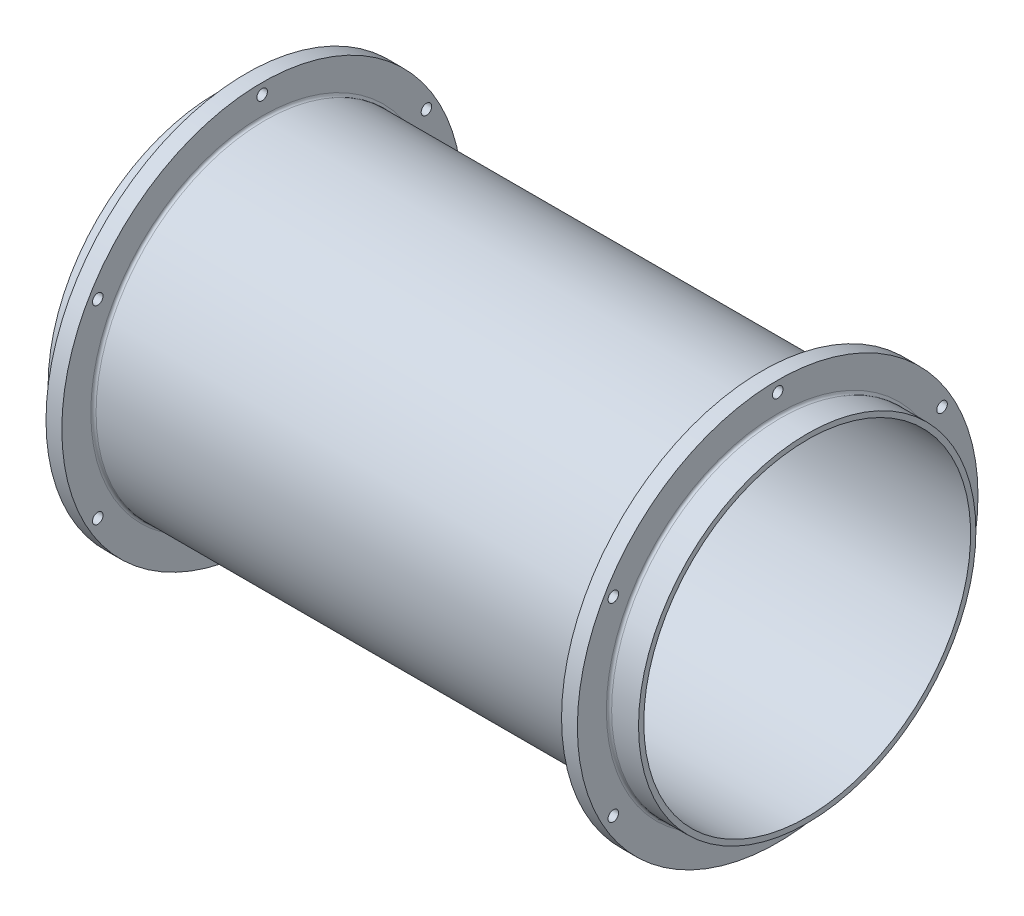
ISO-10303-21;
HEADER;
FILE_DESCRIPTION(('STEP AP214'),'2;1');
FILE_NAME('part.step','',(''),(''),'','','');
FILE_SCHEMA(('AUTOMOTIVE_DESIGN { 1 0 10303 214 1 1 1 1 }'));
ENDSEC;
DATA;
#1=APPLICATION_CONTEXT('core data for automotive mechanical design processes');
#2=APPLICATION_PROTOCOL_DEFINITION('international standard','automotive_design',2000,#1);
#3=PRODUCT_CONTEXT('',#1,'mechanical');
#4=PRODUCT('Part','Part','',(#3));
#5=PRODUCT_RELATED_PRODUCT_CATEGORY('part','',(#4));
#6=PRODUCT_DEFINITION_FORMATION('','',#4);
#7=PRODUCT_DEFINITION_CONTEXT('part definition',#1,'design');
#8=PRODUCT_DEFINITION('design','',#6,#7);
#9=PRODUCT_DEFINITION_SHAPE('','',#8);
#10=(LENGTH_UNIT() NAMED_UNIT(*) SI_UNIT(.MILLI.,.METRE.));
#11=(NAMED_UNIT(*) PLANE_ANGLE_UNIT() SI_UNIT($,.RADIAN.));
#12=(NAMED_UNIT(*) SI_UNIT($,.STERADIAN.) SOLID_ANGLE_UNIT());
#13=UNCERTAINTY_MEASURE_WITH_UNIT(LENGTH_MEASURE(1.E-05),#10,'distance_accuracy_value','');
#14=(GEOMETRIC_REPRESENTATION_CONTEXT(3) GLOBAL_UNCERTAINTY_ASSIGNED_CONTEXT((#13)) GLOBAL_UNIT_ASSIGNED_CONTEXT((#10,
#11,#12)) REPRESENTATION_CONTEXT('',''));
#15=CARTESIAN_POINT('',(0.,0.,0.));
#16=DIRECTION('',(0.,0.,1.));
#17=DIRECTION('',(1.,0.,0.));
#18=AXIS2_PLACEMENT_3D('',#15,#16,#17);
#19=CARTESIAN_POINT('',(0.,0.,0.));
#20=DIRECTION('',(-1.,0.,0.));
#21=DIRECTION('',(0.,0.,1.));
#22=AXIS2_PLACEMENT_3D('',#19,#20,#21);
#23=CYLINDRICAL_SURFACE('',#22,98.425);
#24=CARTESIAN_POINT('',(-177.8,0.,0.));
#25=DIRECTION('',(-1.,0.,0.));
#26=DIRECTION('',(0.,0.,1.));
#27=AXIS2_PLACEMENT_3D('',#24,#25,#26);
#28=CIRCLE('',#27,98.425);
#29=CARTESIAN_POINT('',(-177.8,0.,98.425));
#30=VERTEX_POINT('',#29);
#31=EDGE_CURVE('E120',#30,#30,#28,.T.);
#32=ORIENTED_EDGE('',*,*,#31,.T.);
#33=EDGE_LOOP('',(#32));
#34=FACE_BOUND('',#33,.T.);
#35=CARTESIAN_POINT('',(177.8,0.,0.));
#36=DIRECTION('',(-1.,0.,0.));
#37=DIRECTION('',(0.,0.,1.));
#38=AXIS2_PLACEMENT_3D('',#35,#36,#37);
#39=CIRCLE('',#38,98.425);
#40=CARTESIAN_POINT('',(177.8,0.,98.425));
#41=VERTEX_POINT('',#40);
#42=EDGE_CURVE('E69',#41,#41,#39,.T.);
#43=ORIENTED_EDGE('',*,*,#42,.F.);
#44=EDGE_LOOP('',(#43));
#45=FACE_BOUND('',#44,.T.);
#46=ADVANCED_FACE('F37',(#34,#45),#23,.F.);
#47=CARTESIAN_POINT('',(177.8,0.,0.));
#48=DIRECTION('',(-1.,0.,0.));
#49=DIRECTION('',(0.,0.,1.));
#50=AXIS2_PLACEMENT_3D('',#47,#48,#49);
#51=PLANE('',#50);
#52=CARTESIAN_POINT('',(177.8,0.,0.));
#53=DIRECTION('',(-1.,0.,0.));
#54=DIRECTION('',(0.,0.,1.));
#55=AXIS2_PLACEMENT_3D('',#52,#53,#54);
#56=CIRCLE('',#55,101.6);
#57=CARTESIAN_POINT('',(177.8,0.,101.6));
#58=VERTEX_POINT('',#57);
#59=EDGE_CURVE('E102',#58,#58,#56,.T.);
#60=ORIENTED_EDGE('',*,*,#59,.F.);
#61=EDGE_LOOP('',(#60));
#62=FACE_BOUND('',#61,.T.);
#63=ORIENTED_EDGE('',*,*,#42,.T.);
#64=EDGE_LOOP('',(#63));
#65=FACE_BOUND('',#64,.T.);
#66=ADVANCED_FACE('F205',(#62,#65),#51,.F.);
#67=CARTESIAN_POINT('',(0.,0.,0.));
#68=DIRECTION('',(-1.,0.,0.));
#69=DIRECTION('',(0.,0.,1.));
#70=AXIS2_PLACEMENT_3D('',#67,#68,#69);
#71=CYLINDRICAL_SURFACE('',#70,101.6);
#72=CARTESIAN_POINT('',(161.6075,0.,0.));
#73=DIRECTION('',(-1.,0.,0.));
#74=DIRECTION('',(0.,0.,1.));
#75=AXIS2_PLACEMENT_3D('',#72,#73,#74);
#76=CIRCLE('',#75,101.6);
#77=CARTESIAN_POINT('',(161.6075,0.,101.6));
#78=VERTEX_POINT('',#77);
#79=EDGE_CURVE('E63',#78,#78,#76,.F.);
#80=ORIENTED_EDGE('',*,*,#79,.T.);
#81=EDGE_LOOP('',(#80));
#82=FACE_BOUND('',#81,.T.);
#83=ORIENTED_EDGE('',*,*,#59,.T.);
#84=EDGE_LOOP('',(#83));
#85=FACE_BOUND('',#84,.T.);
#86=ADVANCED_FACE('F172',(#82,#85),#71,.T.);
#87=CARTESIAN_POINT('',(160.02,0.,0.));
#88=DIRECTION('',(-1.,0.,0.));
#89=DIRECTION('',(0.,0.,1.));
#90=AXIS2_PLACEMENT_3D('',#87,#88,#89);
#91=PLANE('',#90);
#92=CARTESIAN_POINT('',(160.02,0.,0.));
#93=DIRECTION('',(-1.,0.,0.));
#94=DIRECTION('',(0.,0.,1.));
#95=AXIS2_PLACEMENT_3D('',#92,#93,#94);
#96=CIRCLE('',#95,103.1875);
#97=CARTESIAN_POINT('',(160.02,0.,103.1875));
#98=VERTEX_POINT('',#97);
#99=EDGE_CURVE('E66',#98,#98,#96,.T.);
#100=ORIENTED_EDGE('',*,*,#99,.T.);
#101=EDGE_LOOP('',(#100));
#102=FACE_BOUND('',#101,.T.);
#103=CARTESIAN_POINT('',(160.02,114.3,0.));
#104=DIRECTION('',(1.,0.,0.));
#105=DIRECTION('',(0.,0.,-1.));
#106=AXIS2_PLACEMENT_3D('',#103,#104,#105);
#107=CIRCLE('',#106,3.17499999999998);
#108=CARTESIAN_POINT('',(160.02,114.3,-3.17499999999998));
#109=VERTEX_POINT('',#108);
#110=EDGE_CURVE('E99',#109,#109,#107,.T.);
#111=ORIENTED_EDGE('',*,*,#110,.F.);
#112=EDGE_LOOP('',(#111));
#113=FACE_BOUND('',#112,.T.);
#114=CARTESIAN_POINT('',(160.02,57.1499999999943,98.9867036525581));
#115=DIRECTION('',(1.,0.,0.));
#116=DIRECTION('',(0.,0.,-1.));
#117=AXIS2_PLACEMENT_3D('',#114,#115,#116);
#118=CIRCLE('',#117,3.17500000000607);
#119=CARTESIAN_POINT('',(160.02,57.1499999999943,95.8117036525521));
#120=VERTEX_POINT('',#119);
#121=EDGE_CURVE('E152',#120,#120,#118,.T.);
#122=ORIENTED_EDGE('',*,*,#121,.F.);
#123=EDGE_LOOP('',(#122));
#124=FACE_BOUND('',#123,.T.);
#125=CARTESIAN_POINT('',(160.02,-57.1500000000056,98.9867036525516));
#126=DIRECTION('',(1.,0.,0.));
#127=DIRECTION('',(0.,0.,-1.));
#128=AXIS2_PLACEMENT_3D('',#125,#126,#127);
#129=CIRCLE('',#128,3.17500000001196);
#130=CARTESIAN_POINT('',(160.02,-57.1500000000056,95.8117036525397));
#131=VERTEX_POINT('',#130);
#132=EDGE_CURVE('E148',#131,#131,#129,.T.);
#133=ORIENTED_EDGE('',*,*,#132,.F.);
#134=EDGE_LOOP('',(#133));
#135=FACE_BOUND('',#134,.T.);
#136=CARTESIAN_POINT('',(160.02,-114.3,-1.29524124128379E-11));
#137=DIRECTION('',(1.,0.,0.));
#138=DIRECTION('',(0.,0.,-1.));
#139=AXIS2_PLACEMENT_3D('',#136,#137,#138);
#140=CIRCLE('',#139,3.17500000001313);
#141=CARTESIAN_POINT('',(160.02,-114.3,-3.17500000002608));
#142=VERTEX_POINT('',#141);
#143=EDGE_CURVE('E151',#142,#142,#140,.T.);
#144=ORIENTED_EDGE('',*,*,#143,.F.);
#145=EDGE_LOOP('',(#144));
#146=FACE_BOUND('',#145,.T.);
#147=CARTESIAN_POINT('',(160.02,-57.1499999999944,-98.9867036525711));
#148=DIRECTION('',(1.,0.,0.));
#149=DIRECTION('',(0.,0.,-1.));
#150=AXIS2_PLACEMENT_3D('',#147,#148,#149);
#151=CIRCLE('',#150,3.17500000000817);
#152=CARTESIAN_POINT('',(160.02,-57.1499999999944,-102.161703652579));
#153=VERTEX_POINT('',#152);
#154=EDGE_CURVE('E155',#153,#153,#151,.T.);
#155=ORIENTED_EDGE('',*,*,#154,.F.);
#156=EDGE_LOOP('',(#155));
#157=FACE_BOUND('',#156,.T.);
#158=CARTESIAN_POINT('',(160.02,57.1500000000056,-98.9867036525646));
#159=DIRECTION('',(1.,0.,0.));
#160=DIRECTION('',(0.,0.,-1.));
#161=AXIS2_PLACEMENT_3D('',#158,#159,#160);
#162=CIRCLE('',#161,3.17500000000172);
#163=CARTESIAN_POINT('',(160.02,57.1500000000056,-102.161703652566));
#164=VERTEX_POINT('',#163);
#165=EDGE_CURVE('E158',#164,#164,#162,.T.);
#166=ORIENTED_EDGE('',*,*,#165,.F.);
#167=EDGE_LOOP('',(#166));
#168=FACE_BOUND('',#167,.T.);
#169=CARTESIAN_POINT('',(160.02,0.,0.));
#170=DIRECTION('',(-1.,0.,0.));
#171=DIRECTION('',(0.,0.,1.));
#172=AXIS2_PLACEMENT_3D('',#169,#170,#171);
#173=CIRCLE('',#172,120.65);
#174=CARTESIAN_POINT('',(160.02,0.,120.65));
#175=VERTEX_POINT('',#174);
#176=EDGE_CURVE('E105',#175,#175,#173,.T.);
#177=ORIENTED_EDGE('',*,*,#176,.F.);
#178=EDGE_LOOP('',(#177));
#179=FACE_BOUND('',#178,.T.);
#180=ADVANCED_FACE('F168',(#102,#113,#124,#135,#146,#157,#168,#179),#91,.F.);
#181=CARTESIAN_POINT('',(0.,0.,0.));
#182=DIRECTION('',(-1.,0.,0.));
#183=DIRECTION('',(0.,0.,1.));
#184=AXIS2_PLACEMENT_3D('',#181,#182,#183);
#185=CYLINDRICAL_SURFACE('',#184,120.65);
#186=ORIENTED_EDGE('',*,*,#176,.T.);
#187=EDGE_LOOP('',(#186));
#188=FACE_BOUND('',#187,.T.);
#189=CARTESIAN_POINT('',(150.495,0.,0.));
#190=DIRECTION('',(-1.,0.,0.));
#191=DIRECTION('',(0.,0.,1.));
#192=AXIS2_PLACEMENT_3D('',#189,#190,#191);
#193=CIRCLE('',#192,120.65);
#194=CARTESIAN_POINT('',(150.495,0.,120.65));
#195=VERTEX_POINT('',#194);
#196=EDGE_CURVE('E108',#195,#195,#193,.T.);
#197=ORIENTED_EDGE('',*,*,#196,.F.);
#198=EDGE_LOOP('',(#197));
#199=FACE_BOUND('',#198,.T.);
#200=ADVANCED_FACE('F171',(#188,#199),#185,.T.);
#201=CARTESIAN_POINT('',(150.495,0.,0.));
#202=DIRECTION('',(-1.,0.,0.));
#203=DIRECTION('',(0.,0.,1.));
#204=AXIS2_PLACEMENT_3D('',#201,#202,#203);
#205=PLANE('',#204);
#206=CARTESIAN_POINT('',(150.495,0.,0.));
#207=DIRECTION('',(-1.,0.,0.));
#208=DIRECTION('',(0.,0.,1.));
#209=AXIS2_PLACEMENT_3D('',#206,#207,#208);
#210=CIRCLE('',#209,103.1875);
#211=CARTESIAN_POINT('',(150.495,0.,103.1875));
#212=VERTEX_POINT('',#211);
#213=EDGE_CURVE('E52',#212,#212,#210,.F.);
#214=ORIENTED_EDGE('',*,*,#213,.T.);
#215=EDGE_LOOP('',(#214));
#216=FACE_BOUND('',#215,.T.);
#217=CARTESIAN_POINT('',(150.495,114.3,0.));
#218=DIRECTION('',(-1.,0.,0.));
#219=DIRECTION('',(0.,0.,1.));
#220=AXIS2_PLACEMENT_3D('',#217,#218,#219);
#221=CIRCLE('',#220,3.17499999999998);
#222=CARTESIAN_POINT('',(150.495,114.3,3.17499999999998));
#223=VERTEX_POINT('',#222);
#224=EDGE_CURVE('E123',#223,#223,#221,.T.);
#225=ORIENTED_EDGE('',*,*,#224,.F.);
#226=EDGE_LOOP('',(#225));
#227=FACE_BOUND('',#226,.T.);
#228=CARTESIAN_POINT('',(150.495,57.1499999999943,98.9867036525581));
#229=DIRECTION('',(-1.,0.,0.));
#230=DIRECTION('',(0.,0.,1.));
#231=AXIS2_PLACEMENT_3D('',#228,#229,#230);
#232=CIRCLE('',#231,3.17500000000607);
#233=CARTESIAN_POINT('',(150.495,57.1499999999943,102.161703652564));
#234=VERTEX_POINT('',#233);
#235=EDGE_CURVE('E74',#234,#234,#232,.T.);
#236=ORIENTED_EDGE('',*,*,#235,.F.);
#237=EDGE_LOOP('',(#236));
#238=FACE_BOUND('',#237,.T.);
#239=CARTESIAN_POINT('',(150.495,-57.1500000000056,98.9867036525516));
#240=DIRECTION('',(-1.,0.,0.));
#241=DIRECTION('',(0.,0.,1.));
#242=AXIS2_PLACEMENT_3D('',#239,#240,#241);
#243=CIRCLE('',#242,3.17500000001196);
#244=CARTESIAN_POINT('',(150.495,-57.1500000000056,102.161703652564));
#245=VERTEX_POINT('',#244);
#246=EDGE_CURVE('E79',#245,#245,#243,.T.);
#247=ORIENTED_EDGE('',*,*,#246,.F.);
#248=EDGE_LOOP('',(#247));
#249=FACE_BOUND('',#248,.T.);
#250=CARTESIAN_POINT('',(150.495,-114.3,-1.29524124128379E-11));
#251=DIRECTION('',(-1.,0.,0.));
#252=DIRECTION('',(0.,0.,1.));
#253=AXIS2_PLACEMENT_3D('',#250,#251,#252);
#254=CIRCLE('',#253,3.17500000001313);
#255=CARTESIAN_POINT('',(150.495,-114.3,3.17500000000018));
#256=VERTEX_POINT('',#255);
#257=EDGE_CURVE('E84',#256,#256,#254,.T.);
#258=ORIENTED_EDGE('',*,*,#257,.F.);
#259=EDGE_LOOP('',(#258));
#260=FACE_BOUND('',#259,.T.);
#261=CARTESIAN_POINT('',(150.495,-57.1499999999944,-98.9867036525711));
#262=DIRECTION('',(-1.,0.,0.));
#263=DIRECTION('',(0.,0.,1.));
#264=AXIS2_PLACEMENT_3D('',#261,#262,#263);
#265=CIRCLE('',#264,3.17500000000817);
#266=CARTESIAN_POINT('',(150.495,-57.1499999999944,-95.8117036525629));
#267=VERTEX_POINT('',#266);
#268=EDGE_CURVE('E89',#267,#267,#265,.T.);
#269=ORIENTED_EDGE('',*,*,#268,.F.);
#270=EDGE_LOOP('',(#269));
#271=FACE_BOUND('',#270,.T.);
#272=CARTESIAN_POINT('',(150.495,57.1500000000056,-98.9867036525646));
#273=DIRECTION('',(-1.,0.,0.));
#274=DIRECTION('',(0.,0.,1.));
#275=AXIS2_PLACEMENT_3D('',#272,#273,#274);
#276=CIRCLE('',#275,3.17500000000172);
#277=CARTESIAN_POINT('',(150.495,57.1500000000056,-95.8117036525629));
#278=VERTEX_POINT('',#277);
#279=EDGE_CURVE('E94',#278,#278,#276,.T.);
#280=ORIENTED_EDGE('',*,*,#279,.F.);
#281=EDGE_LOOP('',(#280));
#282=FACE_BOUND('',#281,.T.);
#283=ORIENTED_EDGE('',*,*,#196,.T.);
#284=EDGE_LOOP('',(#283));
#285=FACE_BOUND('',#284,.T.);
#286=ADVANCED_FACE('F189',(#216,#227,#238,#249,#260,#271,#282,#285),#205,.T.);
#287=CARTESIAN_POINT('',(0.,0.,0.));
#288=DIRECTION('',(-1.,0.,0.));
#289=DIRECTION('',(0.,0.,1.));
#290=AXIS2_PLACEMENT_3D('',#287,#288,#289);
#291=CYLINDRICAL_SURFACE('',#290,101.6);
#292=CARTESIAN_POINT('',(148.9075,0.,0.));
#293=DIRECTION('',(-1.,0.,0.));
#294=DIRECTION('',(0.,0.,1.));
#295=AXIS2_PLACEMENT_3D('',#292,#293,#294);
#296=CIRCLE('',#295,101.6);
#297=CARTESIAN_POINT('',(148.9075,0.,101.6));
#298=VERTEX_POINT('',#297);
#299=EDGE_CURVE('E57',#298,#298,#296,.T.);
#300=ORIENTED_EDGE('',*,*,#299,.T.);
#301=EDGE_LOOP('',(#300));
#302=FACE_BOUND('',#301,.T.);
#303=CARTESIAN_POINT('',(-148.9075,0.,0.));
#304=DIRECTION('',(-1.,0.,0.));
#305=DIRECTION('',(0.,0.,1.));
#306=AXIS2_PLACEMENT_3D('',#303,#304,#305);
#307=CIRCLE('',#306,101.6);
#308=CARTESIAN_POINT('',(-148.9075,0.,101.6));
#309=VERTEX_POINT('',#308);
#310=EDGE_CURVE('E60',#309,#309,#307,.F.);
#311=ORIENTED_EDGE('',*,*,#310,.T.);
#312=EDGE_LOOP('',(#311));
#313=FACE_BOUND('',#312,.T.);
#314=ADVANCED_FACE('F194',(#302,#313),#291,.T.);
#315=CARTESIAN_POINT('',(-150.495,0.,0.));
#316=DIRECTION('',(-1.,0.,0.));
#317=DIRECTION('',(0.,0.,1.));
#318=AXIS2_PLACEMENT_3D('',#315,#316,#317);
#319=PLANE('',#318);
#320=CARTESIAN_POINT('',(-150.495,0.,0.));
#321=DIRECTION('',(-1.,0.,0.));
#322=DIRECTION('',(0.,0.,1.));
#323=AXIS2_PLACEMENT_3D('',#320,#321,#322);
#324=CIRCLE('',#323,103.1875);
#325=CARTESIAN_POINT('',(-150.495,0.,103.1875));
#326=VERTEX_POINT('',#325);
#327=EDGE_CURVE('E10',#326,#326,#324,.T.);
#328=ORIENTED_EDGE('',*,*,#327,.T.);
#329=EDGE_LOOP('',(#328));
#330=FACE_BOUND('',#329,.T.);
#331=CARTESIAN_POINT('',(-150.495,114.3,0.));
#332=DIRECTION('',(-1.,0.,0.));
#333=DIRECTION('',(0.,0.,1.));
#334=AXIS2_PLACEMENT_3D('',#331,#332,#333);
#335=CIRCLE('',#334,3.17499999999998);
#336=CARTESIAN_POINT('',(-150.495,114.3,3.17499999999998));
#337=VERTEX_POINT('',#336);
#338=EDGE_CURVE('E73',#337,#337,#335,.T.);
#339=ORIENTED_EDGE('',*,*,#338,.T.);
#340=EDGE_LOOP('',(#339));
#341=FACE_BOUND('',#340,.T.);
#342=CARTESIAN_POINT('',(-150.495,57.1499999999943,98.9867036525581));
#343=DIRECTION('',(-1.,0.,0.));
#344=DIRECTION('',(0.,0.,1.));
#345=AXIS2_PLACEMENT_3D('',#342,#343,#344);
#346=CIRCLE('',#345,3.17500000000607);
#347=CARTESIAN_POINT('',(-150.495,57.1499999999943,102.161703652564));
#348=VERTEX_POINT('',#347);
#349=EDGE_CURVE('E78',#348,#348,#346,.T.);
#350=ORIENTED_EDGE('',*,*,#349,.T.);
#351=EDGE_LOOP('',(#350));
#352=FACE_BOUND('',#351,.T.);
#353=CARTESIAN_POINT('',(-150.495,-57.1500000000056,98.9867036525516));
#354=DIRECTION('',(-1.,0.,0.));
#355=DIRECTION('',(0.,0.,1.));
#356=AXIS2_PLACEMENT_3D('',#353,#354,#355);
#357=CIRCLE('',#356,3.17500000001196);
#358=CARTESIAN_POINT('',(-150.495,-57.1500000000056,102.161703652564));
#359=VERTEX_POINT('',#358);
#360=EDGE_CURVE('E83',#359,#359,#357,.T.);
#361=ORIENTED_EDGE('',*,*,#360,.T.);
#362=EDGE_LOOP('',(#361));
#363=FACE_BOUND('',#362,.T.);
#364=CARTESIAN_POINT('',(-150.495,-114.3,-1.29524124128379E-11));
#365=DIRECTION('',(-1.,0.,0.));
#366=DIRECTION('',(0.,0.,1.));
#367=AXIS2_PLACEMENT_3D('',#364,#365,#366);
#368=CIRCLE('',#367,3.17500000001313);
#369=CARTESIAN_POINT('',(-150.495,-114.3,3.17500000000018));
#370=VERTEX_POINT('',#369);
#371=EDGE_CURVE('E88',#370,#370,#368,.T.);
#372=ORIENTED_EDGE('',*,*,#371,.T.);
#373=EDGE_LOOP('',(#372));
#374=FACE_BOUND('',#373,.T.);
#375=CARTESIAN_POINT('',(-150.495,-57.1499999999944,-98.9867036525711));
#376=DIRECTION('',(-1.,0.,0.));
#377=DIRECTION('',(0.,0.,1.));
#378=AXIS2_PLACEMENT_3D('',#375,#376,#377);
#379=CIRCLE('',#378,3.17500000000817);
#380=CARTESIAN_POINT('',(-150.495,-57.1499999999944,-95.8117036525629));
#381=VERTEX_POINT('',#380);
#382=EDGE_CURVE('E93',#381,#381,#379,.T.);
#383=ORIENTED_EDGE('',*,*,#382,.T.);
#384=EDGE_LOOP('',(#383));
#385=FACE_BOUND('',#384,.T.);
#386=CARTESIAN_POINT('',(-150.495,57.1500000000056,-98.9867036525646));
#387=DIRECTION('',(-1.,0.,0.));
#388=DIRECTION('',(0.,0.,1.));
#389=AXIS2_PLACEMENT_3D('',#386,#387,#388);
#390=CIRCLE('',#389,3.17500000000172);
#391=CARTESIAN_POINT('',(-150.495,57.1500000000056,-95.8117036525629));
#392=VERTEX_POINT('',#391);
#393=EDGE_CURVE('E98',#392,#392,#390,.T.);
#394=ORIENTED_EDGE('',*,*,#393,.T.);
#395=EDGE_LOOP('',(#394));
#396=FACE_BOUND('',#395,.T.);
#397=CARTESIAN_POINT('',(-150.495,0.,0.));
#398=DIRECTION('',(-1.,0.,0.));
#399=DIRECTION('',(0.,0.,1.));
#400=AXIS2_PLACEMENT_3D('',#397,#398,#399);
#401=CIRCLE('',#400,120.65);
#402=CARTESIAN_POINT('',(-150.495,0.,120.65));
#403=VERTEX_POINT('',#402);
#404=EDGE_CURVE('E111',#403,#403,#401,.T.);
#405=ORIENTED_EDGE('',*,*,#404,.F.);
#406=EDGE_LOOP('',(#405));
#407=FACE_BOUND('',#406,.T.);
#408=ADVANCED_FACE('F200',(#330,#341,#352,#363,#374,#385,#396,#407),#319,.F.);
#409=CARTESIAN_POINT('',(0.,0.,0.));
#410=DIRECTION('',(-1.,0.,0.));
#411=DIRECTION('',(0.,0.,1.));
#412=AXIS2_PLACEMENT_3D('',#409,#410,#411);
#413=CYLINDRICAL_SURFACE('',#412,120.65);
#414=ORIENTED_EDGE('',*,*,#404,.T.);
#415=EDGE_LOOP('',(#414));
#416=FACE_BOUND('',#415,.T.);
#417=CARTESIAN_POINT('',(-160.02,0.,0.));
#418=DIRECTION('',(-1.,0.,0.));
#419=DIRECTION('',(0.,0.,1.));
#420=AXIS2_PLACEMENT_3D('',#417,#418,#419);
#421=CIRCLE('',#420,120.65);
#422=CARTESIAN_POINT('',(-160.02,0.,120.65));
#423=VERTEX_POINT('',#422);
#424=EDGE_CURVE('E114',#423,#423,#421,.T.);
#425=ORIENTED_EDGE('',*,*,#424,.F.);
#426=EDGE_LOOP('',(#425));
#427=FACE_BOUND('',#426,.T.);
#428=ADVANCED_FACE('F259',(#416,#427),#413,.T.);
#429=CARTESIAN_POINT('',(-160.02,0.,0.));
#430=DIRECTION('',(-1.,0.,0.));
#431=DIRECTION('',(0.,0.,1.));
#432=AXIS2_PLACEMENT_3D('',#429,#430,#431);
#433=PLANE('',#432);
#434=CARTESIAN_POINT('',(-160.02,0.,0.));
#435=DIRECTION('',(-1.,0.,0.));
#436=DIRECTION('',(0.,0.,1.));
#437=AXIS2_PLACEMENT_3D('',#434,#435,#436);
#438=CIRCLE('',#437,103.1875);
#439=CARTESIAN_POINT('',(-160.02,0.,103.1875));
#440=VERTEX_POINT('',#439);
#441=EDGE_CURVE('E44',#440,#440,#438,.F.);
#442=ORIENTED_EDGE('',*,*,#441,.T.);
#443=EDGE_LOOP('',(#442));
#444=FACE_BOUND('',#443,.T.);
#445=CARTESIAN_POINT('',(-160.02,114.3,0.));
#446=DIRECTION('',(-1.,0.,0.));
#447=DIRECTION('',(0.,0.,1.));
#448=AXIS2_PLACEMENT_3D('',#445,#446,#447);
#449=CIRCLE('',#448,3.17499999999998);
#450=CARTESIAN_POINT('',(-160.02,114.3,3.17499999999998));
#451=VERTEX_POINT('',#450);
#452=EDGE_CURVE('E70',#451,#451,#449,.T.);
#453=ORIENTED_EDGE('',*,*,#452,.F.);
#454=EDGE_LOOP('',(#453));
#455=FACE_BOUND('',#454,.T.);
#456=CARTESIAN_POINT('',(-160.02,57.1499999999943,98.9867036525581));
#457=DIRECTION('',(-1.,0.,0.));
#458=DIRECTION('',(0.,0.,1.));
#459=AXIS2_PLACEMENT_3D('',#456,#457,#458);
#460=CIRCLE('',#459,3.17500000000607);
#461=CARTESIAN_POINT('',(-160.02,57.1499999999943,102.161703652564));
#462=VERTEX_POINT('',#461);
#463=EDGE_CURVE('E75',#462,#462,#460,.T.);
#464=ORIENTED_EDGE('',*,*,#463,.F.);
#465=EDGE_LOOP('',(#464));
#466=FACE_BOUND('',#465,.T.);
#467=CARTESIAN_POINT('',(-160.02,-57.1500000000056,98.9867036525516));
#468=DIRECTION('',(-1.,0.,0.));
#469=DIRECTION('',(0.,0.,1.));
#470=AXIS2_PLACEMENT_3D('',#467,#468,#469);
#471=CIRCLE('',#470,3.17500000001196);
#472=CARTESIAN_POINT('',(-160.02,-57.1500000000056,102.161703652564));
#473=VERTEX_POINT('',#472);
#474=EDGE_CURVE('E80',#473,#473,#471,.T.);
#475=ORIENTED_EDGE('',*,*,#474,.F.);
#476=EDGE_LOOP('',(#475));
#477=FACE_BOUND('',#476,.T.);
#478=CARTESIAN_POINT('',(-160.02,-114.3,-1.29524124128379E-11));
#479=DIRECTION('',(-1.,0.,0.));
#480=DIRECTION('',(0.,0.,1.));
#481=AXIS2_PLACEMENT_3D('',#478,#479,#480);
#482=CIRCLE('',#481,3.17500000001313);
#483=CARTESIAN_POINT('',(-160.02,-114.3,3.17500000000018));
#484=VERTEX_POINT('',#483);
#485=EDGE_CURVE('E85',#484,#484,#482,.T.);
#486=ORIENTED_EDGE('',*,*,#485,.F.);
#487=EDGE_LOOP('',(#486));
#488=FACE_BOUND('',#487,.T.);
#489=CARTESIAN_POINT('',(-160.02,-57.1499999999944,-98.9867036525711));
#490=DIRECTION('',(-1.,0.,0.));
#491=DIRECTION('',(0.,0.,1.));
#492=AXIS2_PLACEMENT_3D('',#489,#490,#491);
#493=CIRCLE('',#492,3.17500000000817);
#494=CARTESIAN_POINT('',(-160.02,-57.1499999999944,-95.8117036525629));
#495=VERTEX_POINT('',#494);
#496=EDGE_CURVE('E90',#495,#495,#493,.T.);
#497=ORIENTED_EDGE('',*,*,#496,.F.);
#498=EDGE_LOOP('',(#497));
#499=FACE_BOUND('',#498,.T.);
#500=CARTESIAN_POINT('',(-160.02,57.1500000000056,-98.9867036525646));
#501=DIRECTION('',(-1.,0.,0.));
#502=DIRECTION('',(0.,0.,1.));
#503=AXIS2_PLACEMENT_3D('',#500,#501,#502);
#504=CIRCLE('',#503,3.17500000000172);
#505=CARTESIAN_POINT('',(-160.02,57.1500000000056,-95.8117036525629));
#506=VERTEX_POINT('',#505);
#507=EDGE_CURVE('E95',#506,#506,#504,.T.);
#508=ORIENTED_EDGE('',*,*,#507,.F.);
#509=EDGE_LOOP('',(#508));
#510=FACE_BOUND('',#509,.T.);
#511=ORIENTED_EDGE('',*,*,#424,.T.);
#512=EDGE_LOOP('',(#511));
#513=FACE_BOUND('',#512,.T.);
#514=ADVANCED_FACE('F237',(#444,#455,#466,#477,#488,#499,#510,#513),#433,.T.);
#515=CARTESIAN_POINT('',(0.,0.,0.));
#516=DIRECTION('',(-1.,0.,0.));
#517=DIRECTION('',(0.,0.,1.));
#518=AXIS2_PLACEMENT_3D('',#515,#516,#517);
#519=CYLINDRICAL_SURFACE('',#518,101.6);
#520=CARTESIAN_POINT('',(-161.6075,0.,0.));
#521=DIRECTION('',(-1.,0.,0.));
#522=DIRECTION('',(0.,0.,1.));
#523=AXIS2_PLACEMENT_3D('',#520,#521,#522);
#524=CIRCLE('',#523,101.6);
#525=CARTESIAN_POINT('',(-161.6075,0.,101.6));
#526=VERTEX_POINT('',#525);
#527=EDGE_CURVE('E48',#526,#526,#524,.T.);
#528=ORIENTED_EDGE('',*,*,#527,.T.);
#529=EDGE_LOOP('',(#528));
#530=FACE_BOUND('',#529,.T.);
#531=CARTESIAN_POINT('',(-177.8,0.,0.));
#532=DIRECTION('',(-1.,0.,0.));
#533=DIRECTION('',(0.,0.,1.));
#534=AXIS2_PLACEMENT_3D('',#531,#532,#533);
#535=CIRCLE('',#534,101.6);
#536=CARTESIAN_POINT('',(-177.8,0.,101.6));
#537=VERTEX_POINT('',#536);
#538=EDGE_CURVE('E117',#537,#537,#535,.T.);
#539=ORIENTED_EDGE('',*,*,#538,.F.);
#540=EDGE_LOOP('',(#539));
#541=FACE_BOUND('',#540,.T.);
#542=ADVANCED_FACE('F233',(#530,#541),#519,.T.);
#543=CARTESIAN_POINT('',(-177.8,0.,0.));
#544=DIRECTION('',(-1.,0.,0.));
#545=DIRECTION('',(0.,0.,1.));
#546=AXIS2_PLACEMENT_3D('',#543,#544,#545);
#547=PLANE('',#546);
#548=ORIENTED_EDGE('',*,*,#538,.T.);
#549=EDGE_LOOP('',(#548));
#550=FACE_BOUND('',#549,.T.);
#551=ORIENTED_EDGE('',*,*,#31,.F.);
#552=EDGE_LOOP('',(#551));
#553=FACE_BOUND('',#552,.T.);
#554=ADVANCED_FACE('F236',(#550,#553),#547,.T.);
#555=CARTESIAN_POINT('',(-177.8,57.1500000000056,-98.9867036525646));
#556=DIRECTION('',(1.,0.,0.));
#557=DIRECTION('',(0.,0.,-1.));
#558=AXIS2_PLACEMENT_3D('',#555,#556,#557);
#559=CYLINDRICAL_SURFACE('',#558,3.17500000000172);
#560=ORIENTED_EDGE('',*,*,#507,.T.);
#561=EDGE_LOOP('',(#560));
#562=FACE_BOUND('',#561,.T.);
#563=ORIENTED_EDGE('',*,*,#393,.F.);
#564=EDGE_LOOP('',(#563));
#565=FACE_BOUND('',#564,.T.);
#566=ADVANCED_FACE('F243',(#562,#565),#559,.F.);
#567=CARTESIAN_POINT('',(-177.8,-57.1499999999944,-98.9867036525711));
#568=DIRECTION('',(1.,0.,0.));
#569=DIRECTION('',(0.,0.,-1.));
#570=AXIS2_PLACEMENT_3D('',#567,#568,#569);
#571=CYLINDRICAL_SURFACE('',#570,3.17500000000817);
#572=ORIENTED_EDGE('',*,*,#496,.T.);
#573=EDGE_LOOP('',(#572));
#574=FACE_BOUND('',#573,.T.);
#575=ORIENTED_EDGE('',*,*,#382,.F.);
#576=EDGE_LOOP('',(#575));
#577=FACE_BOUND('',#576,.T.);
#578=ADVANCED_FACE('F249',(#574,#577),#571,.F.);
#579=CARTESIAN_POINT('',(-177.8,-114.3,-1.29524124128379E-11));
#580=DIRECTION('',(1.,0.,0.));
#581=DIRECTION('',(0.,0.,-1.));
#582=AXIS2_PLACEMENT_3D('',#579,#580,#581);
#583=CYLINDRICAL_SURFACE('',#582,3.17500000001313);
#584=ORIENTED_EDGE('',*,*,#485,.T.);
#585=EDGE_LOOP('',(#584));
#586=FACE_BOUND('',#585,.T.);
#587=ORIENTED_EDGE('',*,*,#371,.F.);
#588=EDGE_LOOP('',(#587));
#589=FACE_BOUND('',#588,.T.);
#590=ADVANCED_FACE('F286',(#586,#589),#583,.F.);
#591=CARTESIAN_POINT('',(-177.8,-57.1500000000056,98.9867036525516));
#592=DIRECTION('',(1.,0.,0.));
#593=DIRECTION('',(0.,0.,-1.));
#594=AXIS2_PLACEMENT_3D('',#591,#592,#593);
#595=CYLINDRICAL_SURFACE('',#594,3.17500000001196);
#596=ORIENTED_EDGE('',*,*,#474,.T.);
#597=EDGE_LOOP('',(#596));
#598=FACE_BOUND('',#597,.T.);
#599=ORIENTED_EDGE('',*,*,#360,.F.);
#600=EDGE_LOOP('',(#599));
#601=FACE_BOUND('',#600,.T.);
#602=ADVANCED_FACE('F293',(#598,#601),#595,.F.);
#603=CARTESIAN_POINT('',(-177.8,57.1499999999943,98.9867036525581));
#604=DIRECTION('',(1.,0.,0.));
#605=DIRECTION('',(0.,0.,-1.));
#606=AXIS2_PLACEMENT_3D('',#603,#604,#605);
#607=CYLINDRICAL_SURFACE('',#606,3.17500000000607);
#608=ORIENTED_EDGE('',*,*,#463,.T.);
#609=EDGE_LOOP('',(#608));
#610=FACE_BOUND('',#609,.T.);
#611=ORIENTED_EDGE('',*,*,#349,.F.);
#612=EDGE_LOOP('',(#611));
#613=FACE_BOUND('',#612,.T.);
#614=ADVANCED_FACE('F314',(#610,#613),#607,.F.);
#615=CARTESIAN_POINT('',(-177.8,114.3,0.));
#616=DIRECTION('',(1.,0.,0.));
#617=DIRECTION('',(0.,0.,-1.));
#618=AXIS2_PLACEMENT_3D('',#615,#616,#617);
#619=CYLINDRICAL_SURFACE('',#618,3.17499999999998);
#620=ORIENTED_EDGE('',*,*,#452,.T.);
#621=EDGE_LOOP('',(#620));
#622=FACE_BOUND('',#621,.T.);
#623=ORIENTED_EDGE('',*,*,#338,.F.);
#624=EDGE_LOOP('',(#623));
#625=FACE_BOUND('',#624,.T.);
#626=ADVANCED_FACE('F303',(#622,#625),#619,.F.);
#627=ORIENTED_EDGE('',*,*,#279,.T.);
#628=EDGE_LOOP('',(#627));
#629=FACE_BOUND('',#628,.T.);
#630=ORIENTED_EDGE('',*,*,#165,.T.);
#631=EDGE_LOOP('',(#630));
#632=FACE_BOUND('',#631,.T.);
#633=ADVANCED_FACE('F252',(#629,#632),#559,.F.);
#634=ORIENTED_EDGE('',*,*,#268,.T.);
#635=EDGE_LOOP('',(#634));
#636=FACE_BOUND('',#635,.T.);
#637=ORIENTED_EDGE('',*,*,#154,.T.);
#638=EDGE_LOOP('',(#637));
#639=FACE_BOUND('',#638,.T.);
#640=ADVANCED_FACE('F289',(#636,#639),#571,.F.);
#641=ORIENTED_EDGE('',*,*,#257,.T.);
#642=EDGE_LOOP('',(#641));
#643=FACE_BOUND('',#642,.T.);
#644=ORIENTED_EDGE('',*,*,#143,.T.);
#645=EDGE_LOOP('',(#644));
#646=FACE_BOUND('',#645,.T.);
#647=ADVANCED_FACE('F295',(#643,#646),#583,.F.);
#648=ORIENTED_EDGE('',*,*,#246,.T.);
#649=EDGE_LOOP('',(#648));
#650=FACE_BOUND('',#649,.T.);
#651=ORIENTED_EDGE('',*,*,#132,.T.);
#652=EDGE_LOOP('',(#651));
#653=FACE_BOUND('',#652,.T.);
#654=ADVANCED_FACE('F254',(#650,#653),#595,.F.);
#655=ORIENTED_EDGE('',*,*,#235,.T.);
#656=EDGE_LOOP('',(#655));
#657=FACE_BOUND('',#656,.T.);
#658=ORIENTED_EDGE('',*,*,#121,.T.);
#659=EDGE_LOOP('',(#658));
#660=FACE_BOUND('',#659,.T.);
#661=ADVANCED_FACE('F318',(#657,#660),#607,.F.);
#662=ORIENTED_EDGE('',*,*,#224,.T.);
#663=EDGE_LOOP('',(#662));
#664=FACE_BOUND('',#663,.T.);
#665=ORIENTED_EDGE('',*,*,#110,.T.);
#666=EDGE_LOOP('',(#665));
#667=FACE_BOUND('',#666,.T.);
#668=ADVANCED_FACE('F166',(#664,#667),#619,.F.);
#669=CARTESIAN_POINT('',(161.6075,0.,0.));
#670=DIRECTION('',(-1.,0.,0.));
#671=DIRECTION('',(0.,0.,1.));
#672=AXIS2_PLACEMENT_3D('',#669,#670,#671);
#673=TOROIDAL_SURFACE('',#672,103.1875,1.5875);
#674=ORIENTED_EDGE('',*,*,#79,.F.);
#675=EDGE_LOOP('',(#674));
#676=FACE_BOUND('',#675,.T.);
#677=ORIENTED_EDGE('',*,*,#99,.F.);
#678=EDGE_LOOP('',(#677));
#679=FACE_BOUND('',#678,.T.);
#680=ADVANCED_FACE('F216',(#676,#679),#673,.F.);
#681=CARTESIAN_POINT('',(148.9075,0.,0.));
#682=DIRECTION('',(-1.,0.,0.));
#683=DIRECTION('',(0.,0.,1.));
#684=AXIS2_PLACEMENT_3D('',#681,#682,#683);
#685=TOROIDAL_SURFACE('',#684,103.1875,1.5875);
#686=ORIENTED_EDGE('',*,*,#213,.F.);
#687=EDGE_LOOP('',(#686));
#688=FACE_BOUND('',#687,.T.);
#689=ORIENTED_EDGE('',*,*,#299,.F.);
#690=EDGE_LOOP('',(#689));
#691=FACE_BOUND('',#690,.T.);
#692=ADVANCED_FACE('F219',(#688,#691),#685,.F.);
#693=CARTESIAN_POINT('',(-161.6075,0.,0.));
#694=DIRECTION('',(-1.,0.,0.));
#695=DIRECTION('',(0.,0.,1.));
#696=AXIS2_PLACEMENT_3D('',#693,#694,#695);
#697=TOROIDAL_SURFACE('',#696,103.1875,1.5875);
#698=ORIENTED_EDGE('',*,*,#441,.F.);
#699=EDGE_LOOP('',(#698));
#700=FACE_BOUND('',#699,.T.);
#701=ORIENTED_EDGE('',*,*,#527,.F.);
#702=EDGE_LOOP('',(#701));
#703=FACE_BOUND('',#702,.T.);
#704=ADVANCED_FACE('F222',(#700,#703),#697,.F.);
#705=CARTESIAN_POINT('',(-148.9075,0.,0.));
#706=DIRECTION('',(-1.,0.,0.));
#707=DIRECTION('',(0.,0.,1.));
#708=AXIS2_PLACEMENT_3D('',#705,#706,#707);
#709=TOROIDAL_SURFACE('',#708,103.1875,1.5875);
#710=ORIENTED_EDGE('',*,*,#310,.F.);
#711=EDGE_LOOP('',(#710));
#712=FACE_BOUND('',#711,.T.);
#713=ORIENTED_EDGE('',*,*,#327,.F.);
#714=EDGE_LOOP('',(#713));
#715=FACE_BOUND('',#714,.T.);
#716=ADVANCED_FACE('F39',(#712,#715),#709,.F.);
#717=CLOSED_SHELL('',(#46,#66,#86,#180,#200,#286,#314,#408,#428,#514,#542,#554,#566,#578,#590,
#602,#614,#626,#633,#640,#647,#654,#661,#668,#680,#692,#704,#716));
#718=MANIFOLD_SOLID_BREP('B2',#717);
#719=ADVANCED_BREP_SHAPE_REPRESENTATION('',(#18,#718),#14);
#720=SHAPE_DEFINITION_REPRESENTATION(#9,#719);
ENDSEC;
END-ISO-10303-21;
